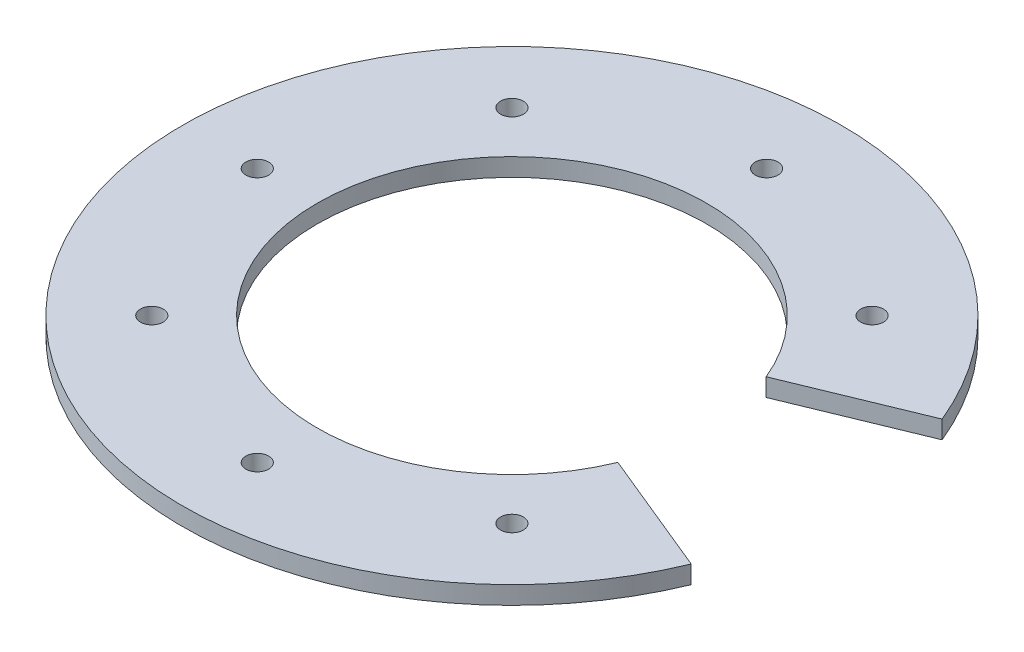
ISO-10303-21;
HEADER;
FILE_DESCRIPTION(('STEP AP214'),'2;1');
FILE_NAME('part.step','',(''),(''),'','','');
FILE_SCHEMA(('AUTOMOTIVE_DESIGN { 1 0 10303 214 1 1 1 1 }'));
ENDSEC;
DATA;
#1=APPLICATION_CONTEXT('core data for automotive mechanical design processes');
#2=APPLICATION_PROTOCOL_DEFINITION('international standard','automotive_design',2000,#1);
#3=PRODUCT_CONTEXT('',#1,'mechanical');
#4=PRODUCT('Part','Part','',(#3));
#5=PRODUCT_RELATED_PRODUCT_CATEGORY('part','',(#4));
#6=PRODUCT_DEFINITION_FORMATION('','',#4);
#7=PRODUCT_DEFINITION_CONTEXT('part definition',#1,'design');
#8=PRODUCT_DEFINITION('design','',#6,#7);
#9=PRODUCT_DEFINITION_SHAPE('','',#8);
#10=(LENGTH_UNIT() NAMED_UNIT(*) SI_UNIT(.MILLI.,.METRE.));
#11=(NAMED_UNIT(*) PLANE_ANGLE_UNIT() SI_UNIT($,.RADIAN.));
#12=(NAMED_UNIT(*) SI_UNIT($,.STERADIAN.) SOLID_ANGLE_UNIT());
#13=UNCERTAINTY_MEASURE_WITH_UNIT(LENGTH_MEASURE(1.E-05),#10,'distance_accuracy_value','');
#14=(GEOMETRIC_REPRESENTATION_CONTEXT(3) GLOBAL_UNCERTAINTY_ASSIGNED_CONTEXT((#13)) GLOBAL_UNIT_ASSIGNED_CONTEXT((#10,
#11,#12)) REPRESENTATION_CONTEXT('',''));
#15=CARTESIAN_POINT('',(0.,0.,0.));
#16=DIRECTION('',(0.,0.,1.));
#17=DIRECTION('',(1.,0.,0.));
#18=AXIS2_PLACEMENT_3D('',#15,#16,#17);
#19=CARTESIAN_POINT('',(0.,3.,0.));
#20=DIRECTION('',(0.,1.,0.));
#21=DIRECTION('',(0.,0.,1.));
#22=AXIS2_PLACEMENT_3D('',#19,#20,#21);
#23=PLANE('',#22);
#24=CARTESIAN_POINT('',(-42.5,3.,3.62838318452536E-12));
#25=DIRECTION('',(0.,1.,0.));
#26=DIRECTION('',(0.,0.,1.));
#27=AXIS2_PLACEMENT_3D('',#24,#25,#26);
#28=CIRCLE('',#27,1.9000000000039);
#29=CARTESIAN_POINT('',(-42.5,3.,1.90000000000753));
#30=VERTEX_POINT('',#29);
#31=EDGE_CURVE('E166',#30,#30,#28,.T.);
#32=ORIENTED_EDGE('',*,*,#31,.F.);
#33=EDGE_LOOP('',(#32));
#34=FACE_BOUND('',#33,.T.);
#35=CARTESIAN_POINT('',(3.62425425341838E-12,3.,42.5000000000036));
#36=DIRECTION('',(0.,1.,0.));
#37=DIRECTION('',(0.,0.,1.));
#38=AXIS2_PLACEMENT_3D('',#35,#36,#37);
#39=CIRCLE('',#38,1.90000000000269);
#40=CARTESIAN_POINT('',(3.62425425341838E-12,3.,44.4000000000063));
#41=VERTEX_POINT('',#40);
#42=EDGE_CURVE('E150',#41,#41,#39,.T.);
#43=ORIENTED_EDGE('',*,*,#42,.F.);
#44=EDGE_LOOP('',(#43));
#45=FACE_BOUND('',#44,.T.);
#46=CARTESIAN_POINT('',(30.0520382004301,3.,-30.052038200429));
#47=DIRECTION('',(0.,1.,0.));
#48=DIRECTION('',(0.,0.,1.));
#49=AXIS2_PLACEMENT_3D('',#46,#47,#48);
#50=CIRCLE('',#49,1.89999999999882);
#51=CARTESIAN_POINT('',(30.0520382004301,3.,-28.1520382004302));
#52=VERTEX_POINT('',#51);
#53=EDGE_CURVE('E134',#52,#52,#50,.T.);
#54=ORIENTED_EDGE('',*,*,#53,.F.);
#55=EDGE_LOOP('',(#54));
#56=FACE_BOUND('',#55,.T.);
#57=CARTESIAN_POINT('',(0.,3.,0.));
#58=DIRECTION('',(0.,-1.,0.));
#59=DIRECTION('',(0.,0.,1.));
#60=AXIS2_PLACEMENT_3D('',#57,#58,#59);
#61=CIRCLE('',#60,32.5);
#62=CARTESIAN_POINT('',(30.0520382004293,3.,12.374368670762));
#63=VERTEX_POINT('',#62);
#64=CARTESIAN_POINT('',(30.0520382004293,3.,-12.374368670762));
#65=VERTEX_POINT('',#64);
#66=EDGE_CURVE('E92',#63,#65,#61,.T.);
#67=ORIENTED_EDGE('',*,*,#66,.T.);
#68=DIRECTION('',(0.924678098474748,0.,-0.380749805254216));
#69=VECTOR('',#68,1.);
#70=CARTESIAN_POINT('',(30.0520382004293,3.,-12.374368670762));
#71=LINE('',#70,#69);
#72=CARTESIAN_POINT('',(50.8572954161112,3.,-20.9412392889819));
#73=VERTEX_POINT('',#72);
#74=EDGE_CURVE('E87',#65,#73,#71,.T.);
#75=ORIENTED_EDGE('',*,*,#74,.T.);
#76=CARTESIAN_POINT('',(0.,3.,0.));
#77=DIRECTION('',(0.,1.,0.));
#78=DIRECTION('',(0.,0.,1.));
#79=AXIS2_PLACEMENT_3D('',#76,#77,#78);
#80=CIRCLE('',#79,55.);
#81=CARTESIAN_POINT('',(50.8572954161112,3.,20.9412392889819));
#82=VERTEX_POINT('',#81);
#83=EDGE_CURVE('E90',#73,#82,#80,.T.);
#84=ORIENTED_EDGE('',*,*,#83,.T.);
#85=DIRECTION('',(-0.924678098474748,0.,-0.380749805254216));
#86=VECTOR('',#85,1.);
#87=CARTESIAN_POINT('',(30.0520382004293,3.,12.374368670762));
#88=LINE('',#87,#86);
#89=EDGE_CURVE('E57',#82,#63,#88,.T.);
#90=ORIENTED_EDGE('',*,*,#89,.T.);
#91=EDGE_LOOP('',(#67,#75,#84,#90));
#92=FACE_BOUND('',#91,.T.);
#93=CARTESIAN_POINT('',(0.,3.,-42.5));
#94=DIRECTION('',(0.,1.,0.));
#95=DIRECTION('',(0.,0.,1.));
#96=AXIS2_PLACEMENT_3D('',#93,#94,#95);
#97=CIRCLE('',#96,1.9);
#98=CARTESIAN_POINT('',(0.,3.,-40.6));
#99=VERTEX_POINT('',#98);
#100=EDGE_CURVE('E112',#99,#99,#97,.T.);
#101=ORIENTED_EDGE('',*,*,#100,.F.);
#102=EDGE_LOOP('',(#101));
#103=FACE_BOUND('',#102,.T.);
#104=CARTESIAN_POINT('',(30.0520382004326,3.,30.0520382004301));
#105=DIRECTION('',(0.,1.,0.));
#106=DIRECTION('',(0.,0.,1.));
#107=AXIS2_PLACEMENT_3D('',#104,#105,#106);
#108=CIRCLE('',#107,1.90000000000067);
#109=CARTESIAN_POINT('',(30.0520382004326,3.,31.9520382004308));
#110=VERTEX_POINT('',#109);
#111=EDGE_CURVE('E142',#110,#110,#108,.T.);
#112=ORIENTED_EDGE('',*,*,#111,.F.);
#113=EDGE_LOOP('',(#112));
#114=FACE_BOUND('',#113,.T.);
#115=CARTESIAN_POINT('',(-30.0520382004265,3.,30.0520382004326));
#116=DIRECTION('',(0.,1.,0.));
#117=DIRECTION('',(0.,0.,1.));
#118=AXIS2_PLACEMENT_3D('',#115,#116,#117);
#119=CIRCLE('',#118,1.90000000000401);
#120=CARTESIAN_POINT('',(-30.0520382004265,3.,31.9520382004367));
#121=VERTEX_POINT('',#120);
#122=EDGE_CURVE('E158',#121,#121,#119,.T.);
#123=ORIENTED_EDGE('',*,*,#122,.F.);
#124=EDGE_LOOP('',(#123));
#125=FACE_BOUND('',#124,.T.);
#126=CARTESIAN_POINT('',(-30.052038200429,3.,-30.0520382004265));
#127=DIRECTION('',(0.,1.,0.));
#128=DIRECTION('',(0.,0.,1.));
#129=AXIS2_PLACEMENT_3D('',#126,#127,#128);
#130=CIRCLE('',#129,1.90000000000246);
#131=CARTESIAN_POINT('',(-30.052038200429,3.,-28.152038200424));
#132=VERTEX_POINT('',#131);
#133=EDGE_CURVE('E174',#132,#132,#130,.T.);
#134=ORIENTED_EDGE('',*,*,#133,.F.);
#135=EDGE_LOOP('',(#134));
#136=FACE_BOUND('',#135,.T.);
#137=ADVANCED_FACE('F39',(#34,#45,#56,#92,#103,#114,#125,#136),#23,.T.);
#138=CARTESIAN_POINT('',(0.,0.,0.));
#139=DIRECTION('',(0.,1.,0.));
#140=DIRECTION('',(0.,0.,1.));
#141=AXIS2_PLACEMENT_3D('',#138,#139,#140);
#142=PLANE('',#141);
#143=CARTESIAN_POINT('',(0.,0.,0.));
#144=DIRECTION('',(0.,-1.,0.));
#145=DIRECTION('',(0.,0.,1.));
#146=AXIS2_PLACEMENT_3D('',#143,#144,#145);
#147=CIRCLE('',#146,32.5);
#148=CARTESIAN_POINT('',(30.0520382004293,0.,12.374368670762));
#149=VERTEX_POINT('',#148);
#150=CARTESIAN_POINT('',(30.0520382004293,0.,-12.374368670762));
#151=VERTEX_POINT('',#150);
#152=EDGE_CURVE('E108',#149,#151,#147,.T.);
#153=ORIENTED_EDGE('',*,*,#152,.F.);
#154=DIRECTION('',(-0.924678098474748,0.,-0.380749805254216));
#155=VECTOR('',#154,1.);
#156=CARTESIAN_POINT('',(30.0520382004293,0.,12.374368670762));
#157=LINE('',#156,#155);
#158=CARTESIAN_POINT('',(50.8572954161112,0.,20.9412392889819));
#159=VERTEX_POINT('',#158);
#160=EDGE_CURVE('E80',#159,#149,#157,.T.);
#161=ORIENTED_EDGE('',*,*,#160,.F.);
#162=CARTESIAN_POINT('',(0.,0.,0.));
#163=DIRECTION('',(0.,1.,0.));
#164=DIRECTION('',(0.,0.,1.));
#165=AXIS2_PLACEMENT_3D('',#162,#163,#164);
#166=CIRCLE('',#165,55.);
#167=CARTESIAN_POINT('',(50.8572954161112,0.,-20.9412392889819));
#168=VERTEX_POINT('',#167);
#169=EDGE_CURVE('E74',#168,#159,#166,.T.);
#170=ORIENTED_EDGE('',*,*,#169,.F.);
#171=DIRECTION('',(0.924678098474748,0.,-0.380749805254216));
#172=VECTOR('',#171,1.);
#173=CARTESIAN_POINT('',(30.0520382004293,0.,-12.374368670762));
#174=LINE('',#173,#172);
#175=EDGE_CURVE('E97',#151,#168,#174,.T.);
#176=ORIENTED_EDGE('',*,*,#175,.F.);
#177=EDGE_LOOP('',(#153,#161,#170,#176));
#178=FACE_BOUND('',#177,.T.);
#179=CARTESIAN_POINT('',(0.,0.,-42.5));
#180=DIRECTION('',(0.,1.,0.));
#181=DIRECTION('',(0.,0.,1.));
#182=AXIS2_PLACEMENT_3D('',#179,#180,#181);
#183=CIRCLE('',#182,1.9);
#184=CARTESIAN_POINT('',(0.,0.,-40.6));
#185=VERTEX_POINT('',#184);
#186=EDGE_CURVE('E130',#185,#185,#183,.T.);
#187=ORIENTED_EDGE('',*,*,#186,.T.);
#188=EDGE_LOOP('',(#187));
#189=FACE_BOUND('',#188,.T.);
#190=CARTESIAN_POINT('',(30.0520382004301,0.,-30.052038200429));
#191=DIRECTION('',(0.,1.,0.));
#192=DIRECTION('',(0.,0.,1.));
#193=AXIS2_PLACEMENT_3D('',#190,#191,#192);
#194=CIRCLE('',#193,1.89999999999882);
#195=CARTESIAN_POINT('',(30.0520382004301,0.,-28.1520382004302));
#196=VERTEX_POINT('',#195);
#197=EDGE_CURVE('E138',#196,#196,#194,.T.);
#198=ORIENTED_EDGE('',*,*,#197,.T.);
#199=EDGE_LOOP('',(#198));
#200=FACE_BOUND('',#199,.T.);
#201=CARTESIAN_POINT('',(30.0520382004326,0.,30.0520382004301));
#202=DIRECTION('',(0.,1.,0.));
#203=DIRECTION('',(0.,0.,1.));
#204=AXIS2_PLACEMENT_3D('',#201,#202,#203);
#205=CIRCLE('',#204,1.90000000000067);
#206=CARTESIAN_POINT('',(30.0520382004326,0.,31.9520382004308));
#207=VERTEX_POINT('',#206);
#208=EDGE_CURVE('E146',#207,#207,#205,.T.);
#209=ORIENTED_EDGE('',*,*,#208,.T.);
#210=EDGE_LOOP('',(#209));
#211=FACE_BOUND('',#210,.T.);
#212=CARTESIAN_POINT('',(3.62425425341838E-12,0.,42.5000000000036));
#213=DIRECTION('',(0.,1.,0.));
#214=DIRECTION('',(0.,0.,1.));
#215=AXIS2_PLACEMENT_3D('',#212,#213,#214);
#216=CIRCLE('',#215,1.90000000000269);
#217=CARTESIAN_POINT('',(3.62425425341838E-12,0.,44.4000000000063));
#218=VERTEX_POINT('',#217);
#219=EDGE_CURVE('E154',#218,#218,#216,.T.);
#220=ORIENTED_EDGE('',*,*,#219,.T.);
#221=EDGE_LOOP('',(#220));
#222=FACE_BOUND('',#221,.T.);
#223=CARTESIAN_POINT('',(-30.0520382004265,0.,30.0520382004326));
#224=DIRECTION('',(0.,1.,0.));
#225=DIRECTION('',(0.,0.,1.));
#226=AXIS2_PLACEMENT_3D('',#223,#224,#225);
#227=CIRCLE('',#226,1.90000000000401);
#228=CARTESIAN_POINT('',(-30.0520382004265,0.,31.9520382004367));
#229=VERTEX_POINT('',#228);
#230=EDGE_CURVE('E162',#229,#229,#227,.T.);
#231=ORIENTED_EDGE('',*,*,#230,.T.);
#232=EDGE_LOOP('',(#231));
#233=FACE_BOUND('',#232,.T.);
#234=CARTESIAN_POINT('',(-42.5,0.,3.62838318452536E-12));
#235=DIRECTION('',(0.,1.,0.));
#236=DIRECTION('',(0.,0.,1.));
#237=AXIS2_PLACEMENT_3D('',#234,#235,#236);
#238=CIRCLE('',#237,1.9000000000039);
#239=CARTESIAN_POINT('',(-42.5,0.,1.90000000000753));
#240=VERTEX_POINT('',#239);
#241=EDGE_CURVE('E170',#240,#240,#238,.T.);
#242=ORIENTED_EDGE('',*,*,#241,.T.);
#243=EDGE_LOOP('',(#242));
#244=FACE_BOUND('',#243,.T.);
#245=CARTESIAN_POINT('',(-30.052038200429,0.,-30.0520382004265));
#246=DIRECTION('',(0.,1.,0.));
#247=DIRECTION('',(0.,0.,1.));
#248=AXIS2_PLACEMENT_3D('',#245,#246,#247);
#249=CIRCLE('',#248,1.90000000000246);
#250=CARTESIAN_POINT('',(-30.052038200429,0.,-28.152038200424));
#251=VERTEX_POINT('',#250);
#252=EDGE_CURVE('E178',#251,#251,#249,.T.);
#253=ORIENTED_EDGE('',*,*,#252,.T.);
#254=EDGE_LOOP('',(#253));
#255=FACE_BOUND('',#254,.T.);
#256=ADVANCED_FACE('F125',(#178,#189,#200,#211,#222,#233,#244,#255),#142,.F.);
#257=CARTESIAN_POINT('',(0.,3.,0.));
#258=DIRECTION('',(0.,-1.,0.));
#259=DIRECTION('',(0.,0.,-1.));
#260=AXIS2_PLACEMENT_3D('',#257,#258,#259);
#261=CYLINDRICAL_SURFACE('',#260,32.5);
#262=ORIENTED_EDGE('',*,*,#152,.T.);
#263=DIRECTION('',(0.,-1.,0.));
#264=VECTOR('',#263,1.);
#265=CARTESIAN_POINT('',(30.0520382004293,3.,-12.374368670762));
#266=LINE('',#265,#264);
#267=EDGE_CURVE('E11',#65,#151,#266,.T.);
#268=ORIENTED_EDGE('',*,*,#267,.F.);
#269=ORIENTED_EDGE('',*,*,#66,.F.);
#270=DIRECTION('',(0.,-1.,0.));
#271=VECTOR('',#270,1.);
#272=CARTESIAN_POINT('',(30.0520382004293,3.,12.374368670762));
#273=LINE('',#272,#271);
#274=EDGE_CURVE('E104',#63,#149,#273,.T.);
#275=ORIENTED_EDGE('',*,*,#274,.T.);
#276=EDGE_LOOP('',(#262,#268,#269,#275));
#277=FACE_BOUND('',#276,.T.);
#278=ADVANCED_FACE('F41',(#277),#261,.F.);
#279=CARTESIAN_POINT('',(30.0520382004293,3.,-12.374368670762));
#280=DIRECTION('',(-0.380749805254216,0.,-0.924678098474748));
#281=DIRECTION('',(-0.924678098474748,0.,0.380749805254216));
#282=AXIS2_PLACEMENT_3D('',#279,#280,#281);
#283=PLANE('',#282);
#284=ORIENTED_EDGE('',*,*,#175,.T.);
#285=DIRECTION('',(0.,-1.,0.));
#286=VECTOR('',#285,1.);
#287=CARTESIAN_POINT('',(50.8572954161112,3.,-20.9412392889819));
#288=LINE('',#287,#286);
#289=EDGE_CURVE('E49',#73,#168,#288,.T.);
#290=ORIENTED_EDGE('',*,*,#289,.F.);
#291=ORIENTED_EDGE('',*,*,#74,.F.);
#292=ORIENTED_EDGE('',*,*,#267,.T.);
#293=EDGE_LOOP('',(#284,#290,#291,#292));
#294=FACE_BOUND('',#293,.T.);
#295=ADVANCED_FACE('F96',(#294),#283,.F.);
#296=CARTESIAN_POINT('',(0.,3.,0.));
#297=DIRECTION('',(0.,-1.,0.));
#298=DIRECTION('',(0.,0.,-1.));
#299=AXIS2_PLACEMENT_3D('',#296,#297,#298);
#300=CYLINDRICAL_SURFACE('',#299,55.);
#301=ORIENTED_EDGE('',*,*,#169,.T.);
#302=DIRECTION('',(0.,-1.,0.));
#303=VECTOR('',#302,1.);
#304=CARTESIAN_POINT('',(50.8572954161112,3.,20.9412392889819));
#305=LINE('',#304,#303);
#306=EDGE_CURVE('E99',#82,#159,#305,.T.);
#307=ORIENTED_EDGE('',*,*,#306,.F.);
#308=ORIENTED_EDGE('',*,*,#83,.F.);
#309=ORIENTED_EDGE('',*,*,#289,.T.);
#310=EDGE_LOOP('',(#301,#307,#308,#309));
#311=FACE_BOUND('',#310,.T.);
#312=ADVANCED_FACE('F100',(#311),#300,.T.);
#313=CARTESIAN_POINT('',(30.0520382004293,3.,12.374368670762));
#314=DIRECTION('',(-0.380749805254216,0.,0.924678098474748));
#315=DIRECTION('',(0.924678098474748,0.,0.380749805254216));
#316=AXIS2_PLACEMENT_3D('',#313,#314,#315);
#317=PLANE('',#316);
#318=ORIENTED_EDGE('',*,*,#160,.T.);
#319=ORIENTED_EDGE('',*,*,#274,.F.);
#320=ORIENTED_EDGE('',*,*,#89,.F.);
#321=ORIENTED_EDGE('',*,*,#306,.T.);
#322=EDGE_LOOP('',(#318,#319,#320,#321));
#323=FACE_BOUND('',#322,.T.);
#324=ADVANCED_FACE('F122',(#323),#317,.F.);
#325=CARTESIAN_POINT('',(0.,3.,-42.5));
#326=DIRECTION('',(0.,-1.,0.));
#327=DIRECTION('',(0.,0.,-1.));
#328=AXIS2_PLACEMENT_3D('',#325,#326,#327);
#329=CYLINDRICAL_SURFACE('',#328,1.9);
#330=ORIENTED_EDGE('',*,*,#100,.T.);
#331=EDGE_LOOP('',(#330));
#332=FACE_BOUND('',#331,.T.);
#333=ORIENTED_EDGE('',*,*,#186,.F.);
#334=EDGE_LOOP('',(#333));
#335=FACE_BOUND('',#334,.T.);
#336=ADVANCED_FACE('F199',(#332,#335),#329,.F.);
#337=CARTESIAN_POINT('',(30.0520382004301,3.,-30.052038200429));
#338=DIRECTION('',(0.,-1.,0.));
#339=DIRECTION('',(0.,0.,-1.));
#340=AXIS2_PLACEMENT_3D('',#337,#338,#339);
#341=CYLINDRICAL_SURFACE('',#340,1.89999999999882);
#342=ORIENTED_EDGE('',*,*,#53,.T.);
#343=EDGE_LOOP('',(#342));
#344=FACE_BOUND('',#343,.T.);
#345=ORIENTED_EDGE('',*,*,#197,.F.);
#346=EDGE_LOOP('',(#345));
#347=FACE_BOUND('',#346,.T.);
#348=ADVANCED_FACE('F251',(#344,#347),#341,.F.);
#349=CARTESIAN_POINT('',(30.0520382004326,3.,30.0520382004301));
#350=DIRECTION('',(0.,-1.,0.));
#351=DIRECTION('',(0.,0.,-1.));
#352=AXIS2_PLACEMENT_3D('',#349,#350,#351);
#353=CYLINDRICAL_SURFACE('',#352,1.90000000000067);
#354=ORIENTED_EDGE('',*,*,#111,.T.);
#355=EDGE_LOOP('',(#354));
#356=FACE_BOUND('',#355,.T.);
#357=ORIENTED_EDGE('',*,*,#208,.F.);
#358=EDGE_LOOP('',(#357));
#359=FACE_BOUND('',#358,.T.);
#360=ADVANCED_FACE('F259',(#356,#359),#353,.F.);
#361=CARTESIAN_POINT('',(3.62425425341838E-12,3.,42.5000000000036));
#362=DIRECTION('',(0.,-1.,0.));
#363=DIRECTION('',(0.,0.,-1.));
#364=AXIS2_PLACEMENT_3D('',#361,#362,#363);
#365=CYLINDRICAL_SURFACE('',#364,1.90000000000269);
#366=ORIENTED_EDGE('',*,*,#42,.T.);
#367=EDGE_LOOP('',(#366));
#368=FACE_BOUND('',#367,.T.);
#369=ORIENTED_EDGE('',*,*,#219,.F.);
#370=EDGE_LOOP('',(#369));
#371=FACE_BOUND('',#370,.T.);
#372=ADVANCED_FACE('F267',(#368,#371),#365,.F.);
#373=CARTESIAN_POINT('',(-30.0520382004265,3.,30.0520382004326));
#374=DIRECTION('',(0.,-1.,0.));
#375=DIRECTION('',(0.,0.,-1.));
#376=AXIS2_PLACEMENT_3D('',#373,#374,#375);
#377=CYLINDRICAL_SURFACE('',#376,1.90000000000401);
#378=ORIENTED_EDGE('',*,*,#122,.T.);
#379=EDGE_LOOP('',(#378));
#380=FACE_BOUND('',#379,.T.);
#381=ORIENTED_EDGE('',*,*,#230,.F.);
#382=EDGE_LOOP('',(#381));
#383=FACE_BOUND('',#382,.T.);
#384=ADVANCED_FACE('F276',(#380,#383),#377,.F.);
#385=CARTESIAN_POINT('',(-42.5,3.,3.62838318452536E-12));
#386=DIRECTION('',(0.,-1.,0.));
#387=DIRECTION('',(0.,0.,-1.));
#388=AXIS2_PLACEMENT_3D('',#385,#386,#387);
#389=CYLINDRICAL_SURFACE('',#388,1.9000000000039);
#390=ORIENTED_EDGE('',*,*,#31,.T.);
#391=EDGE_LOOP('',(#390));
#392=FACE_BOUND('',#391,.T.);
#393=ORIENTED_EDGE('',*,*,#241,.F.);
#394=EDGE_LOOP('',(#393));
#395=FACE_BOUND('',#394,.T.);
#396=ADVANCED_FACE('F285',(#392,#395),#389,.F.);
#397=CARTESIAN_POINT('',(-30.052038200429,3.,-30.0520382004265));
#398=DIRECTION('',(0.,-1.,0.));
#399=DIRECTION('',(0.,0.,-1.));
#400=AXIS2_PLACEMENT_3D('',#397,#398,#399);
#401=CYLINDRICAL_SURFACE('',#400,1.90000000000246);
#402=ORIENTED_EDGE('',*,*,#133,.T.);
#403=EDGE_LOOP('',(#402));
#404=FACE_BOUND('',#403,.T.);
#405=ORIENTED_EDGE('',*,*,#252,.F.);
#406=EDGE_LOOP('',(#405));
#407=FACE_BOUND('',#406,.T.);
#408=ADVANCED_FACE('F186',(#404,#407),#401,.F.);
#409=CLOSED_SHELL('',(#137,#256,#278,#295,#312,#324,#336,#348,#360,#372,#384,#396,#408));
#410=MANIFOLD_SOLID_BREP('B2',#409);
#411=ADVANCED_BREP_SHAPE_REPRESENTATION('',(#18,#410),#14);
#412=SHAPE_DEFINITION_REPRESENTATION(#9,#411);
ENDSEC;
END-ISO-10303-21;
